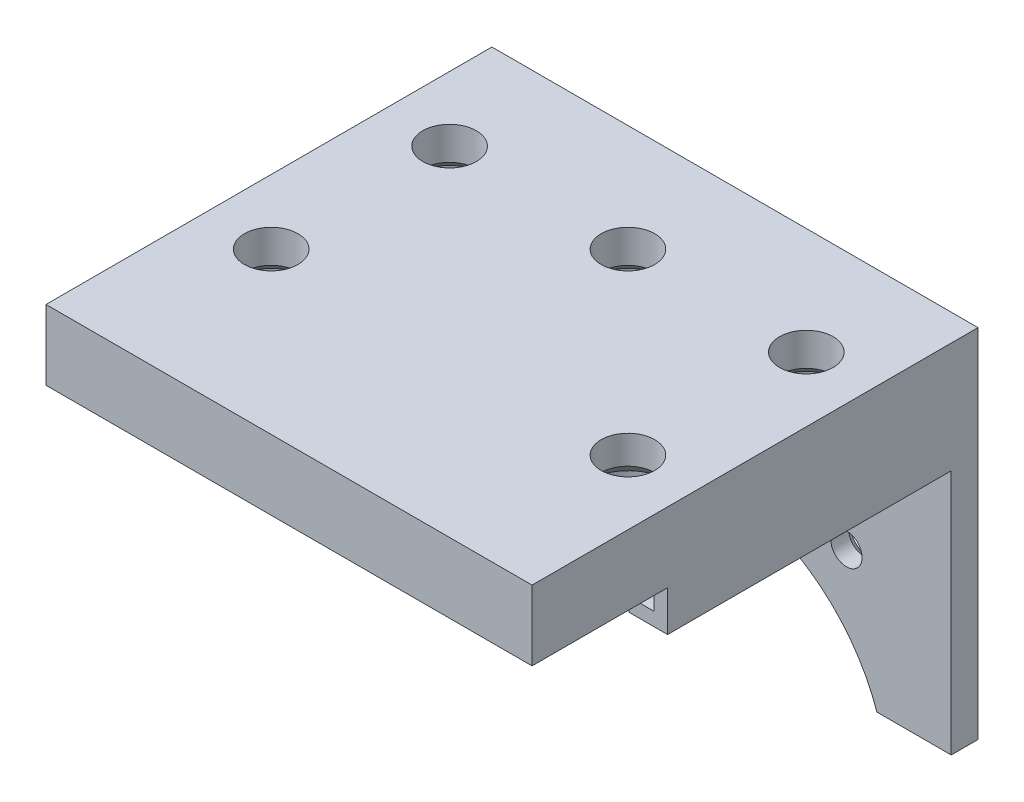
ISO-10303-21;
HEADER;
FILE_DESCRIPTION(('STEP AP214'),'2;1');
FILE_NAME('part.step','',(''),(''),'','','');
FILE_SCHEMA(('AUTOMOTIVE_DESIGN { 1 0 10303 214 1 1 1 1 }'));
ENDSEC;
DATA;
#1=APPLICATION_CONTEXT('core data for automotive mechanical design processes');
#2=APPLICATION_PROTOCOL_DEFINITION('international standard','automotive_design',2000,#1);
#3=PRODUCT_CONTEXT('',#1,'mechanical');
#4=PRODUCT('Part','Part','',(#3));
#5=PRODUCT_RELATED_PRODUCT_CATEGORY('part','',(#4));
#6=PRODUCT_DEFINITION_FORMATION('','',#4);
#7=PRODUCT_DEFINITION_CONTEXT('part definition',#1,'design');
#8=PRODUCT_DEFINITION('design','',#6,#7);
#9=PRODUCT_DEFINITION_SHAPE('','',#8);
#10=(LENGTH_UNIT() NAMED_UNIT(*) SI_UNIT(.MILLI.,.METRE.));
#11=(NAMED_UNIT(*) PLANE_ANGLE_UNIT() SI_UNIT($,.RADIAN.));
#12=(NAMED_UNIT(*) SI_UNIT($,.STERADIAN.) SOLID_ANGLE_UNIT());
#13=UNCERTAINTY_MEASURE_WITH_UNIT(LENGTH_MEASURE(1.E-05),#10,'distance_accuracy_value','');
#14=(GEOMETRIC_REPRESENTATION_CONTEXT(3) GLOBAL_UNCERTAINTY_ASSIGNED_CONTEXT((#13)) GLOBAL_UNIT_ASSIGNED_CONTEXT((#10,
#11,#12)) REPRESENTATION_CONTEXT('',''));
#15=CARTESIAN_POINT('',(0.,0.,0.));
#16=DIRECTION('',(0.,0.,1.));
#17=DIRECTION('',(1.,0.,0.));
#18=AXIS2_PLACEMENT_3D('',#15,#16,#17);
#19=CARTESIAN_POINT('',(48.65,-1.5,-9.5));
#20=DIRECTION('',(1.,0.,0.));
#21=DIRECTION('',(0.,0.,-1.));
#22=AXIS2_PLACEMENT_3D('',#19,#20,#21);
#23=PLANE('',#22);
#24=DIRECTION('',(0.,1.,0.));
#25=VECTOR('',#24,1.);
#26=CARTESIAN_POINT('',(48.65,-1.5,-6.5));
#27=LINE('',#26,#25);
#28=CARTESIAN_POINT('',(48.65,0.,-6.5));
#29=VERTEX_POINT('',#28);
#30=CARTESIAN_POINT('',(48.65,3.05,-6.5));
#31=VERTEX_POINT('',#30);
#32=EDGE_CURVE('E225',#29,#31,#27,.T.);
#33=ORIENTED_EDGE('',*,*,#32,.F.);
#34=DIRECTION('',(0.,0.,-1.));
#35=VECTOR('',#34,1.);
#36=CARTESIAN_POINT('',(48.65,0.,-9.5));
#37=LINE('',#36,#35);
#38=CARTESIAN_POINT('',(48.65,0.,25.309371378812));
#39=VERTEX_POINT('',#38);
#40=EDGE_CURVE('E285',#39,#29,#37,.T.);
#41=ORIENTED_EDGE('',*,*,#40,.F.);
#42=DIRECTION('',(0.,1.,0.));
#43=VECTOR('',#42,1.);
#44=CARTESIAN_POINT('',(48.65,-1.5,25.309371378812));
#45=LINE('',#44,#43);
#46=CARTESIAN_POINT('',(48.65,3.05,25.309371378812));
#47=VERTEX_POINT('',#46);
#48=EDGE_CURVE('E304',#39,#47,#45,.T.);
#49=ORIENTED_EDGE('',*,*,#48,.T.);
#50=DIRECTION('',(0.,0.,-1.));
#51=VECTOR('',#50,1.);
#52=CARTESIAN_POINT('',(48.65,3.05,-9.5));
#53=LINE('',#52,#51);
#54=EDGE_CURVE('E298',#47,#31,#53,.T.);
#55=ORIENTED_EDGE('',*,*,#54,.T.);
#56=EDGE_LOOP('',(#33,#41,#49,#55));
#57=FACE_BOUND('',#56,.T.);
#58=ADVANCED_FACE('F43',(#57),#23,.F.);
#59=CARTESIAN_POINT('',(0.,3.05,0.));
#60=DIRECTION('',(0.,-1.,0.));
#61=DIRECTION('',(0.,0.,-1.));
#62=AXIS2_PLACEMENT_3D('',#59,#60,#61);
#63=PLANE('',#62);
#64=CARTESIAN_POINT('',(42.9,3.05,22.5));
#65=DIRECTION('',(0.,-1.,0.));
#66=DIRECTION('',(0.,0.,-1.));
#67=AXIS2_PLACEMENT_3D('',#64,#65,#66);
#68=CIRCLE('',#67,4.5);
#69=CARTESIAN_POINT('',(42.9,3.05,18.));
#70=VERTEX_POINT('',#69);
#71=EDGE_CURVE('E237',#70,#70,#68,.T.);
#72=ORIENTED_EDGE('',*,*,#71,.F.);
#73=EDGE_LOOP('',(#72));
#74=FACE_BOUND('',#73,.T.);
#75=CARTESIAN_POINT('',(2.90000000000001,3.05,2.5));
#76=DIRECTION('',(0.,-1.,0.));
#77=DIRECTION('',(0.,0.,-1.));
#78=AXIS2_PLACEMENT_3D('',#75,#76,#77);
#79=CIRCLE('',#78,4.50000000000001);
#80=CARTESIAN_POINT('',(2.90000000000001,3.05,-2.00000000000001));
#81=VERTEX_POINT('',#80);
#82=EDGE_CURVE('E249',#81,#81,#79,.T.);
#83=ORIENTED_EDGE('',*,*,#82,.F.);
#84=EDGE_LOOP('',(#83));
#85=FACE_BOUND('',#84,.T.);
#86=CARTESIAN_POINT('',(42.9,3.05,2.5));
#87=DIRECTION('',(0.,-1.,0.));
#88=DIRECTION('',(0.,0.,-1.));
#89=AXIS2_PLACEMENT_3D('',#86,#87,#88);
#90=CIRCLE('',#89,4.50000000000001);
#91=CARTESIAN_POINT('',(42.9,3.05,-2.00000000000001));
#92=VERTEX_POINT('',#91);
#93=EDGE_CURVE('E258',#92,#92,#90,.T.);
#94=ORIENTED_EDGE('',*,*,#93,.F.);
#95=EDGE_LOOP('',(#94));
#96=FACE_BOUND('',#95,.T.);
#97=CARTESIAN_POINT('',(22.9,3.05,2.5));
#98=DIRECTION('',(0.,-1.,0.));
#99=DIRECTION('',(0.,0.,-1.));
#100=AXIS2_PLACEMENT_3D('',#97,#98,#99);
#101=CIRCLE('',#100,4.50000000000001);
#102=CARTESIAN_POINT('',(22.9,3.05,-2.00000000000001));
#103=VERTEX_POINT('',#102);
#104=EDGE_CURVE('E267',#103,#103,#101,.T.);
#105=ORIENTED_EDGE('',*,*,#104,.F.);
#106=EDGE_LOOP('',(#105));
#107=FACE_BOUND('',#106,.T.);
#108=CARTESIAN_POINT('',(2.9,3.05,22.5));
#109=DIRECTION('',(0.,-1.,0.));
#110=DIRECTION('',(0.,0.,-1.));
#111=AXIS2_PLACEMENT_3D('',#108,#109,#110);
#112=CIRCLE('',#111,4.50000000000001);
#113=CARTESIAN_POINT('',(2.9,3.05,18.));
#114=VERTEX_POINT('',#113);
#115=EDGE_CURVE('E276',#114,#114,#112,.T.);
#116=ORIENTED_EDGE('',*,*,#115,.F.);
#117=EDGE_LOOP('',(#116));
#118=FACE_BOUND('',#117,.T.);
#119=DIRECTION('',(0.,0.,1.));
#120=VECTOR('',#119,1.);
#121=CARTESIAN_POINT('',(-2.85,3.05,-15.7948391560071));
#122=LINE('',#121,#120);
#123=CARTESIAN_POINT('',(-2.85,3.05,-6.5));
#124=VERTEX_POINT('',#123);
#125=CARTESIAN_POINT('',(-2.85,3.05,25.5));
#126=VERTEX_POINT('',#125);
#127=EDGE_CURVE('E339',#124,#126,#122,.T.);
#128=ORIENTED_EDGE('',*,*,#127,.F.);
#129=DIRECTION('',(1.,0.,0.));
#130=VECTOR('',#129,1.);
#131=CARTESIAN_POINT('',(0.,3.05,-6.5));
#132=LINE('',#131,#130);
#133=EDGE_CURVE('E58',#124,#31,#132,.T.);
#134=ORIENTED_EDGE('',*,*,#133,.T.);
#135=ORIENTED_EDGE('',*,*,#54,.F.);
#136=DIRECTION('',(-1.,0.,0.));
#137=VECTOR('',#136,1.);
#138=CARTESIAN_POINT('',(48.65,3.05,25.309371378812));
#139=LINE('',#138,#137);
#140=CARTESIAN_POINT('',(50.15,3.05,25.309371378812));
#141=VERTEX_POINT('',#140);
#142=EDGE_CURVE('E301',#141,#47,#139,.T.);
#143=ORIENTED_EDGE('',*,*,#142,.F.);
#144=DIRECTION('',(0.,0.,1.));
#145=VECTOR('',#144,1.);
#146=CARTESIAN_POINT('',(50.15,3.05,-9.5));
#147=LINE('',#146,#145);
#148=CARTESIAN_POINT('',(50.15,3.05,40.5));
#149=VERTEX_POINT('',#148);
#150=EDGE_CURVE('E341',#141,#149,#147,.T.);
#151=ORIENTED_EDGE('',*,*,#150,.T.);
#152=DIRECTION('',(1.,0.,0.));
#153=VECTOR('',#152,1.);
#154=CARTESIAN_POINT('',(50.15,3.05,40.5));
#155=LINE('',#154,#153);
#156=CARTESIAN_POINT('',(-4.35,3.05,40.5));
#157=VERTEX_POINT('',#156);
#158=EDGE_CURVE('E317',#157,#149,#155,.T.);
#159=ORIENTED_EDGE('',*,*,#158,.F.);
#160=DIRECTION('',(0.,0.,-1.));
#161=VECTOR('',#160,1.);
#162=CARTESIAN_POINT('',(-4.35,3.05,40.5));
#163=LINE('',#162,#161);
#164=CARTESIAN_POINT('',(-4.35,3.05,25.5));
#165=VERTEX_POINT('',#164);
#166=EDGE_CURVE('E323',#157,#165,#163,.T.);
#167=ORIENTED_EDGE('',*,*,#166,.T.);
#168=DIRECTION('',(1.,0.,0.));
#169=VECTOR('',#168,1.);
#170=CARTESIAN_POINT('',(50.15,3.05,25.5));
#171=LINE('',#170,#169);
#172=EDGE_CURVE('E311',#165,#126,#171,.T.);
#173=ORIENTED_EDGE('',*,*,#172,.T.);
#174=EDGE_LOOP('',(#128,#134,#135,#143,#151,#159,#167,#173));
#175=FACE_BOUND('',#174,.T.);
#176=ADVANCED_FACE('F426',(#74,#85,#96,#107,#118,#175),#63,.T.);
#177=CARTESIAN_POINT('',(-4.35,-1.5,-15.7948391560071));
#178=DIRECTION('',(0.,-1.,0.));
#179=DIRECTION('',(1.,0.,0.));
#180=AXIS2_PLACEMENT_3D('',#177,#178,#179);
#181=PLANE('',#180);
#182=DIRECTION('',(0.,0.,1.));
#183=VECTOR('',#182,1.);
#184=CARTESIAN_POINT('',(-4.35,-1.5,-15.7948391560071));
#185=LINE('',#184,#183);
#186=CARTESIAN_POINT('',(-4.35,-1.5,-6.5));
#187=VERTEX_POINT('',#186);
#188=CARTESIAN_POINT('',(-4.35,-1.5,25.5));
#189=VERTEX_POINT('',#188);
#190=EDGE_CURVE('E66',#187,#189,#185,.T.);
#191=ORIENTED_EDGE('',*,*,#190,.F.);
#192=DIRECTION('',(1.,0.,0.));
#193=VECTOR('',#192,1.);
#194=CARTESIAN_POINT('',(-4.35,-1.5,-6.5));
#195=LINE('',#194,#193);
#196=CARTESIAN_POINT('',(0.,-1.5,-6.5));
#197=VERTEX_POINT('',#196);
#198=EDGE_CURVE('E235',#187,#197,#195,.T.);
#199=ORIENTED_EDGE('',*,*,#198,.T.);
#200=DIRECTION('',(0.,0.,1.));
#201=VECTOR('',#200,1.);
#202=CARTESIAN_POINT('',(0.,-1.5,-15.7948391560071));
#203=LINE('',#202,#201);
#204=CARTESIAN_POINT('',(0.,-1.5,25.5));
#205=VERTEX_POINT('',#204);
#206=EDGE_CURVE('E346',#197,#205,#203,.T.);
#207=ORIENTED_EDGE('',*,*,#206,.T.);
#208=DIRECTION('',(1.,0.,0.));
#209=VECTOR('',#208,1.);
#210=CARTESIAN_POINT('',(-4.35,-1.5,25.5));
#211=LINE('',#210,#209);
#212=EDGE_CURVE('E327',#189,#205,#211,.T.);
#213=ORIENTED_EDGE('',*,*,#212,.F.);
#214=EDGE_LOOP('',(#191,#199,#207,#213));
#215=FACE_BOUND('',#214,.T.);
#216=ADVANCED_FACE('F433',(#215),#181,.T.);
#217=CARTESIAN_POINT('',(0.,-1.5,-15.7948391560071));
#218=DIRECTION('',(1.,0.,0.));
#219=DIRECTION('',(0.,1.,0.));
#220=AXIS2_PLACEMENT_3D('',#217,#218,#219);
#221=PLANE('',#220);
#222=ORIENTED_EDGE('',*,*,#206,.F.);
#223=DIRECTION('',(0.,1.,0.));
#224=VECTOR('',#223,1.);
#225=CARTESIAN_POINT('',(0.,-1.5,-6.5));
#226=LINE('',#225,#224);
#227=CARTESIAN_POINT('',(0.,0.,-6.5));
#228=VERTEX_POINT('',#227);
#229=EDGE_CURVE('E233',#197,#228,#226,.T.);
#230=ORIENTED_EDGE('',*,*,#229,.T.);
#231=DIRECTION('',(0.,0.,1.));
#232=VECTOR('',#231,1.);
#233=CARTESIAN_POINT('',(0.,0.,-15.7948391560071));
#234=LINE('',#233,#232);
#235=CARTESIAN_POINT('',(0.,0.,25.5));
#236=VERTEX_POINT('',#235);
#237=EDGE_CURVE('E344',#228,#236,#234,.T.);
#238=ORIENTED_EDGE('',*,*,#237,.T.);
#239=DIRECTION('',(0.,1.,0.));
#240=VECTOR('',#239,1.);
#241=CARTESIAN_POINT('',(0.,-1.5,25.5));
#242=LINE('',#241,#240);
#243=EDGE_CURVE('E334',#205,#236,#242,.T.);
#244=ORIENTED_EDGE('',*,*,#243,.F.);
#245=EDGE_LOOP('',(#222,#230,#238,#244));
#246=FACE_BOUND('',#245,.T.);
#247=ADVANCED_FACE('F453',(#246),#221,.T.);
#248=CARTESIAN_POINT('',(0.,0.,-15.7948391560071));
#249=DIRECTION('',(0.,1.,0.));
#250=DIRECTION('',(-1.,0.,0.));
#251=AXIS2_PLACEMENT_3D('',#248,#249,#250);
#252=PLANE('',#251);
#253=ORIENTED_EDGE('',*,*,#237,.F.);
#254=DIRECTION('',(-1.,0.,0.));
#255=VECTOR('',#254,1.);
#256=CARTESIAN_POINT('',(0.,0.,-6.5));
#257=LINE('',#256,#255);
#258=CARTESIAN_POINT('',(-2.85,0.,-6.5));
#259=VERTEX_POINT('',#258);
#260=EDGE_CURVE('E231',#228,#259,#257,.T.);
#261=ORIENTED_EDGE('',*,*,#260,.T.);
#262=DIRECTION('',(0.,0.,1.));
#263=VECTOR('',#262,1.);
#264=CARTESIAN_POINT('',(-2.85,0.,-15.7948391560071));
#265=LINE('',#264,#263);
#266=CARTESIAN_POINT('',(-2.85,0.,25.5));
#267=VERTEX_POINT('',#266);
#268=EDGE_CURVE('E342',#259,#267,#265,.T.);
#269=ORIENTED_EDGE('',*,*,#268,.T.);
#270=DIRECTION('',(-1.,0.,0.));
#271=VECTOR('',#270,1.);
#272=CARTESIAN_POINT('',(0.,0.,25.5));
#273=LINE('',#272,#271);
#274=EDGE_CURVE('E331',#236,#267,#273,.T.);
#275=ORIENTED_EDGE('',*,*,#274,.F.);
#276=EDGE_LOOP('',(#253,#261,#269,#275));
#277=FACE_BOUND('',#276,.T.);
#278=ADVANCED_FACE('F449',(#277),#252,.T.);
#279=CARTESIAN_POINT('',(-2.85,0.,-15.7948391560071));
#280=DIRECTION('',(1.,0.,0.));
#281=DIRECTION('',(0.,0.,-1.));
#282=AXIS2_PLACEMENT_3D('',#279,#280,#281);
#283=PLANE('',#282);
#284=ORIENTED_EDGE('',*,*,#268,.F.);
#285=DIRECTION('',(0.,1.,0.));
#286=VECTOR('',#285,1.);
#287=CARTESIAN_POINT('',(-2.85,0.,-6.5));
#288=LINE('',#287,#286);
#289=EDGE_CURVE('E229',#259,#124,#288,.T.);
#290=ORIENTED_EDGE('',*,*,#289,.T.);
#291=ORIENTED_EDGE('',*,*,#127,.T.);
#292=DIRECTION('',(0.,1.,0.));
#293=VECTOR('',#292,1.);
#294=CARTESIAN_POINT('',(-2.85,0.,25.5));
#295=LINE('',#294,#293);
#296=EDGE_CURVE('E328',#267,#126,#295,.T.);
#297=ORIENTED_EDGE('',*,*,#296,.F.);
#298=EDGE_LOOP('',(#284,#290,#291,#297));
#299=FACE_BOUND('',#298,.T.);
#300=ADVANCED_FACE('F445',(#299),#283,.T.);
#301=CARTESIAN_POINT('',(0.,-1.5,0.));
#302=DIRECTION('',(0.,1.,0.));
#303=DIRECTION('',(0.,0.,1.));
#304=AXIS2_PLACEMENT_3D('',#301,#302,#303);
#305=PLANE('',#304);
#306=DIRECTION('',(-1.,0.,0.));
#307=VECTOR('',#306,1.);
#308=CARTESIAN_POINT('',(0.,-1.5,-6.5));
#309=LINE('',#308,#307);
#310=CARTESIAN_POINT('',(50.15,-1.5,-6.5));
#311=VERTEX_POINT('',#310);
#312=CARTESIAN_POINT('',(45.8,-1.5,-6.5));
#313=VERTEX_POINT('',#312);
#314=EDGE_CURVE('E223',#311,#313,#309,.T.);
#315=ORIENTED_EDGE('',*,*,#314,.F.);
#316=DIRECTION('',(0.,0.,1.));
#317=VECTOR('',#316,1.);
#318=CARTESIAN_POINT('',(50.15,-1.5,25.309371378812));
#319=LINE('',#318,#317);
#320=CARTESIAN_POINT('',(50.15,-1.5,25.309371378812));
#321=VERTEX_POINT('',#320);
#322=EDGE_CURVE('E177',#311,#321,#319,.T.);
#323=ORIENTED_EDGE('',*,*,#322,.T.);
#324=DIRECTION('',(-1.,0.,0.));
#325=VECTOR('',#324,1.);
#326=CARTESIAN_POINT('',(48.65,-1.5,25.309371378812));
#327=LINE('',#326,#325);
#328=CARTESIAN_POINT('',(45.8,-1.5,25.309371378812));
#329=VERTEX_POINT('',#328);
#330=EDGE_CURVE('E300',#321,#329,#327,.T.);
#331=ORIENTED_EDGE('',*,*,#330,.T.);
#332=DIRECTION('',(0.,0.,1.));
#333=VECTOR('',#332,1.);
#334=CARTESIAN_POINT('',(45.8,-1.5,25.309371378812));
#335=LINE('',#334,#333);
#336=EDGE_CURVE('E292',#313,#329,#335,.T.);
#337=ORIENTED_EDGE('',*,*,#336,.F.);
#338=EDGE_LOOP('',(#315,#323,#331,#337));
#339=FACE_BOUND('',#338,.T.);
#340=ADVANCED_FACE('F448',(#339),#305,.F.);
#341=CARTESIAN_POINT('',(45.8,0.,-9.5));
#342=DIRECTION('',(0.,-1.,0.));
#343=DIRECTION('',(0.,0.,-1.));
#344=AXIS2_PLACEMENT_3D('',#341,#342,#343);
#345=PLANE('',#344);
#346=DIRECTION('',(1.,0.,0.));
#347=VECTOR('',#346,1.);
#348=CARTESIAN_POINT('',(45.8,0.,-6.5));
#349=LINE('',#348,#347);
#350=CARTESIAN_POINT('',(45.8,0.,-6.5));
#351=VERTEX_POINT('',#350);
#352=EDGE_CURVE('E217',#351,#29,#349,.T.);
#353=ORIENTED_EDGE('',*,*,#352,.F.);
#354=DIRECTION('',(0.,0.,-1.));
#355=VECTOR('',#354,1.);
#356=CARTESIAN_POINT('',(45.8,0.,-9.5));
#357=LINE('',#356,#355);
#358=CARTESIAN_POINT('',(45.8,0.,25.309371378812));
#359=VERTEX_POINT('',#358);
#360=EDGE_CURVE('E289',#359,#351,#357,.T.);
#361=ORIENTED_EDGE('',*,*,#360,.F.);
#362=DIRECTION('',(1.,0.,0.));
#363=VECTOR('',#362,1.);
#364=CARTESIAN_POINT('',(45.8,0.,25.309371378812));
#365=LINE('',#364,#363);
#366=EDGE_CURVE('E294',#359,#39,#365,.T.);
#367=ORIENTED_EDGE('',*,*,#366,.T.);
#368=ORIENTED_EDGE('',*,*,#40,.T.);
#369=EDGE_LOOP('',(#353,#361,#367,#368));
#370=FACE_BOUND('',#369,.T.);
#371=ADVANCED_FACE('F549',(#370),#345,.F.);
#372=CARTESIAN_POINT('',(45.8,0.,0.));
#373=DIRECTION('',(1.,0.,0.));
#374=DIRECTION('',(0.,0.,-1.));
#375=AXIS2_PLACEMENT_3D('',#372,#373,#374);
#376=PLANE('',#375);
#377=DIRECTION('',(0.,1.,0.));
#378=VECTOR('',#377,1.);
#379=CARTESIAN_POINT('',(45.8,0.,-6.5));
#380=LINE('',#379,#378);
#381=EDGE_CURVE('E388',#313,#351,#380,.T.);
#382=ORIENTED_EDGE('',*,*,#381,.F.);
#383=ORIENTED_EDGE('',*,*,#336,.T.);
#384=DIRECTION('',(0.,1.,0.));
#385=VECTOR('',#384,1.);
#386=CARTESIAN_POINT('',(45.8,0.,25.309371378812));
#387=LINE('',#386,#385);
#388=EDGE_CURVE('E286',#329,#359,#387,.T.);
#389=ORIENTED_EDGE('',*,*,#388,.T.);
#390=ORIENTED_EDGE('',*,*,#360,.T.);
#391=EDGE_LOOP('',(#382,#383,#389,#390));
#392=FACE_BOUND('',#391,.T.);
#393=ADVANCED_FACE('F475',(#392),#376,.F.);
#394=CARTESIAN_POINT('',(50.15,10.9,-9.5));
#395=DIRECTION('',(1.,0.,0.));
#396=DIRECTION('',(0.,0.,-1.));
#397=AXIS2_PLACEMENT_3D('',#394,#395,#396);
#398=PLANE('',#397);
#399=DIRECTION('',(0.,0.,1.));
#400=VECTOR('',#399,1.);
#401=CARTESIAN_POINT('',(50.15,10.9,-9.5));
#402=LINE('',#401,#400);
#403=CARTESIAN_POINT('',(50.15,10.9,-9.5));
#404=VERTEX_POINT('',#403);
#405=CARTESIAN_POINT('',(50.15,10.9,40.5));
#406=VERTEX_POINT('',#405);
#407=EDGE_CURVE('E349',#404,#406,#402,.T.);
#408=ORIENTED_EDGE('',*,*,#407,.T.);
#409=DIRECTION('',(0.,1.,0.));
#410=VECTOR('',#409,1.);
#411=CARTESIAN_POINT('',(50.15,10.9,40.5));
#412=LINE('',#411,#410);
#413=EDGE_CURVE('E320',#149,#406,#412,.T.);
#414=ORIENTED_EDGE('',*,*,#413,.F.);
#415=ORIENTED_EDGE('',*,*,#150,.F.);
#416=DIRECTION('',(0.,1.,0.));
#417=VECTOR('',#416,1.);
#418=CARTESIAN_POINT('',(50.15,-1.5,25.309371378812));
#419=LINE('',#418,#417);
#420=EDGE_CURVE('E309',#321,#141,#419,.T.);
#421=ORIENTED_EDGE('',*,*,#420,.F.);
#422=ORIENTED_EDGE('',*,*,#322,.F.);
#423=DIRECTION('',(0.,-1.,0.));
#424=VECTOR('',#423,1.);
#425=CARTESIAN_POINT('',(50.15,10.9,-6.5));
#426=LINE('',#425,#424);
#427=CARTESIAN_POINT('',(50.15,-29.1,-6.5));
#428=VERTEX_POINT('',#427);
#429=EDGE_CURVE('E171',#311,#428,#426,.T.);
#430=ORIENTED_EDGE('',*,*,#429,.T.);
#431=DIRECTION('',(0.,0.,-1.));
#432=VECTOR('',#431,1.);
#433=CARTESIAN_POINT('',(50.15,-29.1,-6.5));
#434=LINE('',#433,#432);
#435=CARTESIAN_POINT('',(50.15,-29.1,-9.5));
#436=VERTEX_POINT('',#435);
#437=EDGE_CURVE('E174',#428,#436,#434,.T.);
#438=ORIENTED_EDGE('',*,*,#437,.T.);
#439=DIRECTION('',(0.,-1.,0.));
#440=VECTOR('',#439,1.);
#441=CARTESIAN_POINT('',(50.15,10.9,-9.5));
#442=LINE('',#441,#440);
#443=EDGE_CURVE('E358',#404,#436,#442,.T.);
#444=ORIENTED_EDGE('',*,*,#443,.F.);
#445=EDGE_LOOP('',(#408,#414,#415,#421,#422,#430,#438,#444));
#446=FACE_BOUND('',#445,.T.);
#447=ADVANCED_FACE('F173',(#446),#398,.T.);
#448=CARTESIAN_POINT('',(-4.35,10.9,-9.5));
#449=DIRECTION('',(0.,0.,-1.));
#450=DIRECTION('',(-1.,0.,0.));
#451=AXIS2_PLACEMENT_3D('',#448,#449,#450);
#452=PLANE('',#451);
#453=CARTESIAN_POINT('',(38.4,-14.95,-9.5));
#454=DIRECTION('',(0.,0.,-1.));
#455=DIRECTION('',(-1.,0.,0.));
#456=AXIS2_PLACEMENT_3D('',#453,#454,#455);
#457=CIRCLE('',#456,2.75000000000001);
#458=CARTESIAN_POINT('',(35.65,-14.95,-9.5));
#459=VERTEX_POINT('',#458);
#460=EDGE_CURVE('E51',#459,#459,#457,.F.);
#461=ORIENTED_EDGE('',*,*,#460,.T.);
#462=EDGE_LOOP('',(#461));
#463=FACE_BOUND('',#462,.T.);
#464=CARTESIAN_POINT('',(7.4,-14.95,-9.5));
#465=DIRECTION('',(0.,0.,-1.));
#466=DIRECTION('',(-1.,0.,0.));
#467=AXIS2_PLACEMENT_3D('',#464,#465,#466);
#468=CIRCLE('',#467,2.75000000000001);
#469=CARTESIAN_POINT('',(4.64999999999999,-14.95,-9.5));
#470=VERTEX_POINT('',#469);
#471=EDGE_CURVE('E394',#470,#470,#468,.F.);
#472=ORIENTED_EDGE('',*,*,#471,.T.);
#473=EDGE_LOOP('',(#472));
#474=FACE_BOUND('',#473,.T.);
#475=ORIENTED_EDGE('',*,*,#443,.T.);
#476=DIRECTION('',(-1.,0.,0.));
#477=VECTOR('',#476,1.);
#478=CARTESIAN_POINT('',(50.15,-29.1,-9.5));
#479=LINE('',#478,#477);
#480=CARTESIAN_POINT('',(41.8142803193777,-29.1,-9.5));
#481=VERTEX_POINT('',#480);
#482=EDGE_CURVE('E188',#436,#481,#479,.T.);
#483=ORIENTED_EDGE('',*,*,#482,.T.);
#484=CARTESIAN_POINT('',(22.9,-35.6,-9.5));
#485=DIRECTION('',(0.,0.,1.));
#486=DIRECTION('',(-1.,0.,0.));
#487=AXIS2_PLACEMENT_3D('',#484,#485,#486);
#488=CIRCLE('',#487,20.);
#489=CARTESIAN_POINT('',(3.98571968062227,-29.1,-9.5));
#490=VERTEX_POINT('',#489);
#491=EDGE_CURVE('E208',#481,#490,#488,.T.);
#492=ORIENTED_EDGE('',*,*,#491,.T.);
#493=DIRECTION('',(-1.,0.,0.));
#494=VECTOR('',#493,1.);
#495=CARTESIAN_POINT('',(3.98571968062227,-29.1,-9.5));
#496=LINE('',#495,#494);
#497=CARTESIAN_POINT('',(-4.35,-29.1,-9.5));
#498=VERTEX_POINT('',#497);
#499=EDGE_CURVE('E182',#490,#498,#496,.T.);
#500=ORIENTED_EDGE('',*,*,#499,.T.);
#501=DIRECTION('',(0.,-1.,0.));
#502=VECTOR('',#501,1.);
#503=CARTESIAN_POINT('',(-4.35,10.9,-9.5));
#504=LINE('',#503,#502);
#505=CARTESIAN_POINT('',(-4.35,10.9,-9.5));
#506=VERTEX_POINT('',#505);
#507=EDGE_CURVE('E361',#506,#498,#504,.T.);
#508=ORIENTED_EDGE('',*,*,#507,.F.);
#509=DIRECTION('',(1.,0.,0.));
#510=VECTOR('',#509,1.);
#511=CARTESIAN_POINT('',(-4.35,10.9,-9.5));
#512=LINE('',#511,#510);
#513=EDGE_CURVE('E353',#506,#404,#512,.T.);
#514=ORIENTED_EDGE('',*,*,#513,.T.);
#515=EDGE_LOOP('',(#475,#483,#492,#500,#508,#514));
#516=FACE_BOUND('',#515,.T.);
#517=ADVANCED_FACE('F399',(#463,#474,#516),#452,.T.);
#518=CARTESIAN_POINT('',(-4.35,10.9,25.5));
#519=DIRECTION('',(-1.,0.,0.));
#520=DIRECTION('',(0.,0.,1.));
#521=AXIS2_PLACEMENT_3D('',#518,#519,#520);
#522=PLANE('',#521);
#523=DIRECTION('',(0.,1.,0.));
#524=VECTOR('',#523,1.);
#525=CARTESIAN_POINT('',(-4.35,10.9,-6.5));
#526=LINE('',#525,#524);
#527=CARTESIAN_POINT('',(-4.35,-29.1,-6.5));
#528=VERTEX_POINT('',#527);
#529=EDGE_CURVE('E190',#528,#187,#526,.T.);
#530=ORIENTED_EDGE('',*,*,#529,.T.);
#531=ORIENTED_EDGE('',*,*,#190,.T.);
#532=DIRECTION('',(0.,-1.,0.));
#533=VECTOR('',#532,1.);
#534=CARTESIAN_POINT('',(-4.35,10.9,25.5));
#535=LINE('',#534,#533);
#536=EDGE_CURVE('E356',#165,#189,#535,.T.);
#537=ORIENTED_EDGE('',*,*,#536,.F.);
#538=ORIENTED_EDGE('',*,*,#166,.F.);
#539=DIRECTION('',(0.,-1.,0.));
#540=VECTOR('',#539,1.);
#541=CARTESIAN_POINT('',(-4.35,3.05,40.5));
#542=LINE('',#541,#540);
#543=CARTESIAN_POINT('',(-4.35,10.9,40.5));
#544=VERTEX_POINT('',#543);
#545=EDGE_CURVE('E315',#544,#157,#542,.T.);
#546=ORIENTED_EDGE('',*,*,#545,.F.);
#547=DIRECTION('',(0.,0.,-1.));
#548=VECTOR('',#547,1.);
#549=CARTESIAN_POINT('',(-4.35,10.9,25.5));
#550=LINE('',#549,#548);
#551=EDGE_CURVE('E351',#544,#506,#550,.T.);
#552=ORIENTED_EDGE('',*,*,#551,.T.);
#553=ORIENTED_EDGE('',*,*,#507,.T.);
#554=DIRECTION('',(0.,0.,-1.));
#555=VECTOR('',#554,1.);
#556=CARTESIAN_POINT('',(-4.35,-29.1,-6.5));
#557=LINE('',#556,#555);
#558=EDGE_CURVE('E214',#528,#498,#557,.T.);
#559=ORIENTED_EDGE('',*,*,#558,.F.);
#560=EDGE_LOOP('',(#530,#531,#537,#538,#546,#552,#553,#559));
#561=FACE_BOUND('',#560,.T.);
#562=ADVANCED_FACE('F466',(#561),#522,.T.);
#563=CARTESIAN_POINT('',(50.15,10.9,25.5));
#564=DIRECTION('',(0.,0.,1.));
#565=DIRECTION('',(1.,0.,0.));
#566=AXIS2_PLACEMENT_3D('',#563,#564,#565);
#567=PLANE('',#566);
#568=ORIENTED_EDGE('',*,*,#172,.F.);
#569=ORIENTED_EDGE('',*,*,#536,.T.);
#570=ORIENTED_EDGE('',*,*,#212,.T.);
#571=ORIENTED_EDGE('',*,*,#243,.T.);
#572=ORIENTED_EDGE('',*,*,#274,.T.);
#573=ORIENTED_EDGE('',*,*,#296,.T.);
#574=EDGE_LOOP('',(#568,#569,#570,#571,#572,#573));
#575=FACE_BOUND('',#574,.T.);
#576=ADVANCED_FACE('F461',(#575),#567,.T.);
#577=CARTESIAN_POINT('',(0.,10.9,0.));
#578=DIRECTION('',(0.,-1.,0.));
#579=DIRECTION('',(0.,0.,-1.));
#580=AXIS2_PLACEMENT_3D('',#577,#578,#579);
#581=PLANE('',#580);
#582=ORIENTED_EDGE('',*,*,#513,.F.);
#583=ORIENTED_EDGE('',*,*,#551,.F.);
#584=DIRECTION('',(-1.,0.,0.));
#585=VECTOR('',#584,1.);
#586=CARTESIAN_POINT('',(-4.35,10.9,40.5));
#587=LINE('',#586,#585);
#588=EDGE_CURVE('E312',#406,#544,#587,.T.);
#589=ORIENTED_EDGE('',*,*,#588,.F.);
#590=ORIENTED_EDGE('',*,*,#407,.F.);
#591=EDGE_LOOP('',(#582,#583,#589,#590));
#592=FACE_BOUND('',#591,.T.);
#593=CARTESIAN_POINT('',(2.9,10.9,22.5));
#594=DIRECTION('',(0.,-1.,0.));
#595=DIRECTION('',(0.,0.,-1.));
#596=AXIS2_PLACEMENT_3D('',#593,#594,#595);
#597=CIRCLE('',#596,3.00000000000001);
#598=CARTESIAN_POINT('',(2.9,10.9,19.5));
#599=VERTEX_POINT('',#598);
#600=EDGE_CURVE('E282',#599,#599,#597,.T.);
#601=ORIENTED_EDGE('',*,*,#600,.T.);
#602=EDGE_LOOP('',(#601));
#603=FACE_BOUND('',#602,.T.);
#604=CARTESIAN_POINT('',(22.9,10.9,2.5));
#605=DIRECTION('',(0.,-1.,0.));
#606=DIRECTION('',(0.,0.,-1.));
#607=AXIS2_PLACEMENT_3D('',#604,#605,#606);
#608=CIRCLE('',#607,3.00000000000001);
#609=CARTESIAN_POINT('',(22.9,10.9,-0.500000000000014));
#610=VERTEX_POINT('',#609);
#611=EDGE_CURVE('E273',#610,#610,#608,.T.);
#612=ORIENTED_EDGE('',*,*,#611,.T.);
#613=EDGE_LOOP('',(#612));
#614=FACE_BOUND('',#613,.T.);
#615=CARTESIAN_POINT('',(42.9,10.9,2.5));
#616=DIRECTION('',(0.,-1.,0.));
#617=DIRECTION('',(0.,0.,-1.));
#618=AXIS2_PLACEMENT_3D('',#615,#616,#617);
#619=CIRCLE('',#618,3.00000000000001);
#620=CARTESIAN_POINT('',(42.9,10.9,-0.50000000000001));
#621=VERTEX_POINT('',#620);
#622=EDGE_CURVE('E264',#621,#621,#619,.T.);
#623=ORIENTED_EDGE('',*,*,#622,.T.);
#624=EDGE_LOOP('',(#623));
#625=FACE_BOUND('',#624,.T.);
#626=CARTESIAN_POINT('',(2.90000000000001,10.9,2.5));
#627=DIRECTION('',(0.,-1.,0.));
#628=DIRECTION('',(0.,0.,-1.));
#629=AXIS2_PLACEMENT_3D('',#626,#627,#628);
#630=CIRCLE('',#629,3.00000000000001);
#631=CARTESIAN_POINT('',(2.90000000000001,10.9,-0.500000000000013));
#632=VERTEX_POINT('',#631);
#633=EDGE_CURVE('E255',#632,#632,#630,.T.);
#634=ORIENTED_EDGE('',*,*,#633,.T.);
#635=EDGE_LOOP('',(#634));
#636=FACE_BOUND('',#635,.T.);
#637=CARTESIAN_POINT('',(42.9,10.9,22.5));
#638=DIRECTION('',(0.,-1.,0.));
#639=DIRECTION('',(0.,0.,-1.));
#640=AXIS2_PLACEMENT_3D('',#637,#638,#639);
#641=CIRCLE('',#640,3.);
#642=CARTESIAN_POINT('',(42.9,10.9,19.5));
#643=VERTEX_POINT('',#642);
#644=EDGE_CURVE('E246',#643,#643,#641,.T.);
#645=ORIENTED_EDGE('',*,*,#644,.T.);
#646=EDGE_LOOP('',(#645));
#647=FACE_BOUND('',#646,.T.);
#648=ADVANCED_FACE('F443',(#592,#603,#614,#625,#636,#647),#581,.F.);
#649=CARTESIAN_POINT('',(0.,0.,40.5));
#650=DIRECTION('',(0.,0.,-1.));
#651=DIRECTION('',(-1.,0.,0.));
#652=AXIS2_PLACEMENT_3D('',#649,#650,#651);
#653=PLANE('',#652);
#654=ORIENTED_EDGE('',*,*,#588,.T.);
#655=ORIENTED_EDGE('',*,*,#545,.T.);
#656=ORIENTED_EDGE('',*,*,#158,.T.);
#657=ORIENTED_EDGE('',*,*,#413,.T.);
#658=EDGE_LOOP('',(#654,#655,#656,#657));
#659=FACE_BOUND('',#658,.T.);
#660=ADVANCED_FACE('F440',(#659),#653,.F.);
#661=CARTESIAN_POINT('',(48.65,-1.5,25.309371378812));
#662=DIRECTION('',(0.,0.,-1.));
#663=DIRECTION('',(-1.,0.,0.));
#664=AXIS2_PLACEMENT_3D('',#661,#662,#663);
#665=PLANE('',#664);
#666=ORIENTED_EDGE('',*,*,#142,.T.);
#667=ORIENTED_EDGE('',*,*,#48,.F.);
#668=ORIENTED_EDGE('',*,*,#366,.F.);
#669=ORIENTED_EDGE('',*,*,#388,.F.);
#670=ORIENTED_EDGE('',*,*,#330,.F.);
#671=ORIENTED_EDGE('',*,*,#420,.T.);
#672=EDGE_LOOP('',(#666,#667,#668,#669,#670,#671));
#673=FACE_BOUND('',#672,.T.);
#674=ADVANCED_FACE('F438',(#673),#665,.F.);
#675=CARTESIAN_POINT('',(2.9,3.05,22.5));
#676=DIRECTION('',(0.,-1.,0.));
#677=DIRECTION('',(0.,0.,-1.));
#678=AXIS2_PLACEMENT_3D('',#675,#676,#677);
#679=CYLINDRICAL_SURFACE('',#678,3.00000000000001);
#680=CARTESIAN_POINT('',(2.9,7.19999999999286,22.5));
#681=DIRECTION('',(0.,1.,0.));
#682=DIRECTION('',(0.,0.,1.));
#683=AXIS2_PLACEMENT_3D('',#680,#681,#682);
#684=CIRCLE('',#683,3.00000000000001);
#685=CARTESIAN_POINT('',(2.9,7.19999999999286,25.5));
#686=VERTEX_POINT('',#685);
#687=EDGE_CURVE('E360',#686,#686,#684,.F.);
#688=ORIENTED_EDGE('',*,*,#687,.T.);
#689=EDGE_LOOP('',(#688));
#690=FACE_BOUND('',#689,.T.);
#691=ORIENTED_EDGE('',*,*,#600,.F.);
#692=EDGE_LOOP('',(#691));
#693=FACE_BOUND('',#692,.T.);
#694=ADVANCED_FACE('F621',(#690,#693),#679,.F.);
#695=CARTESIAN_POINT('',(5.90000000000001,6.2,22.5));
#696=DIRECTION('',(0.,1.,0.));
#697=DIRECTION('',(0.,0.,1.));
#698=AXIS2_PLACEMENT_3D('',#695,#696,#697);
#699=PLANE('',#698);
#700=CARTESIAN_POINT('',(2.9,6.2,22.5));
#701=DIRECTION('',(0.,1.,0.));
#702=DIRECTION('',(0.,0.,1.));
#703=AXIS2_PLACEMENT_3D('',#700,#701,#702);
#704=CIRCLE('',#703,3.99999999999287);
#705=CARTESIAN_POINT('',(2.9,6.2,26.4999999999929));
#706=VERTEX_POINT('',#705);
#707=EDGE_CURVE('E367',#706,#706,#704,.T.);
#708=ORIENTED_EDGE('',*,*,#707,.T.);
#709=EDGE_LOOP('',(#708));
#710=FACE_BOUND('',#709,.T.);
#711=CARTESIAN_POINT('',(2.9,6.2,22.5));
#712=DIRECTION('',(0.,-1.,0.));
#713=DIRECTION('',(0.,0.,-1.));
#714=AXIS2_PLACEMENT_3D('',#711,#712,#713);
#715=CIRCLE('',#714,4.50000000000001);
#716=CARTESIAN_POINT('',(2.9,6.2,18.));
#717=VERTEX_POINT('',#716);
#718=EDGE_CURVE('E279',#717,#717,#715,.T.);
#719=ORIENTED_EDGE('',*,*,#718,.T.);
#720=EDGE_LOOP('',(#719));
#721=FACE_BOUND('',#720,.T.);
#722=ADVANCED_FACE('F617',(#710,#721),#699,.F.);
#723=CARTESIAN_POINT('',(2.9,3.05,22.5));
#724=DIRECTION('',(0.,-1.,0.));
#725=DIRECTION('',(0.,0.,-1.));
#726=AXIS2_PLACEMENT_3D('',#723,#724,#725);
#727=CYLINDRICAL_SURFACE('',#726,4.50000000000001);
#728=ORIENTED_EDGE('',*,*,#718,.F.);
#729=EDGE_LOOP('',(#728));
#730=FACE_BOUND('',#729,.T.);
#731=ORIENTED_EDGE('',*,*,#115,.T.);
#732=EDGE_LOOP('',(#731));
#733=FACE_BOUND('',#732,.T.);
#734=ADVANCED_FACE('F506',(#730,#733),#727,.F.);
#735=CARTESIAN_POINT('',(22.9,3.05,2.5));
#736=DIRECTION('',(0.,-1.,0.));
#737=DIRECTION('',(0.,0.,-1.));
#738=AXIS2_PLACEMENT_3D('',#735,#736,#737);
#739=CYLINDRICAL_SURFACE('',#738,3.00000000000001);
#740=CARTESIAN_POINT('',(22.9,7.19999999999284,2.5));
#741=DIRECTION('',(0.,1.,0.));
#742=DIRECTION('',(0.,0.,1.));
#743=AXIS2_PLACEMENT_3D('',#740,#741,#742);
#744=CIRCLE('',#743,3.00000000000001);
#745=CARTESIAN_POINT('',(22.9,7.19999999999284,5.50000000000001));
#746=VERTEX_POINT('',#745);
#747=EDGE_CURVE('E382',#746,#746,#744,.F.);
#748=ORIENTED_EDGE('',*,*,#747,.T.);
#749=EDGE_LOOP('',(#748));
#750=FACE_BOUND('',#749,.T.);
#751=ORIENTED_EDGE('',*,*,#611,.F.);
#752=EDGE_LOOP('',(#751));
#753=FACE_BOUND('',#752,.T.);
#754=ADVANCED_FACE('F502',(#750,#753),#739,.F.);
#755=CARTESIAN_POINT('',(25.9,6.2,2.5));
#756=DIRECTION('',(0.,1.,0.));
#757=DIRECTION('',(0.,0.,1.));
#758=AXIS2_PLACEMENT_3D('',#755,#756,#757);
#759=PLANE('',#758);
#760=CARTESIAN_POINT('',(22.9,6.2,2.5));
#761=DIRECTION('',(0.,1.,0.));
#762=DIRECTION('',(0.,0.,1.));
#763=AXIS2_PLACEMENT_3D('',#760,#761,#762);
#764=CIRCLE('',#763,3.99999999999286);
#765=CARTESIAN_POINT('',(22.9,6.2,6.49999999999286));
#766=VERTEX_POINT('',#765);
#767=EDGE_CURVE('E385',#766,#766,#764,.T.);
#768=ORIENTED_EDGE('',*,*,#767,.T.);
#769=EDGE_LOOP('',(#768));
#770=FACE_BOUND('',#769,.T.);
#771=CARTESIAN_POINT('',(22.9,6.2,2.5));
#772=DIRECTION('',(0.,-1.,0.));
#773=DIRECTION('',(0.,0.,-1.));
#774=AXIS2_PLACEMENT_3D('',#771,#772,#773);
#775=CIRCLE('',#774,4.50000000000001);
#776=CARTESIAN_POINT('',(22.9,6.2,-2.00000000000001));
#777=VERTEX_POINT('',#776);
#778=EDGE_CURVE('E270',#777,#777,#775,.T.);
#779=ORIENTED_EDGE('',*,*,#778,.T.);
#780=EDGE_LOOP('',(#779));
#781=FACE_BOUND('',#780,.T.);
#782=ADVANCED_FACE('F505',(#770,#781),#759,.F.);
#783=CARTESIAN_POINT('',(22.9,3.05,2.5));
#784=DIRECTION('',(0.,-1.,0.));
#785=DIRECTION('',(0.,0.,-1.));
#786=AXIS2_PLACEMENT_3D('',#783,#784,#785);
#787=CYLINDRICAL_SURFACE('',#786,4.50000000000001);
#788=ORIENTED_EDGE('',*,*,#778,.F.);
#789=EDGE_LOOP('',(#788));
#790=FACE_BOUND('',#789,.T.);
#791=ORIENTED_EDGE('',*,*,#104,.T.);
#792=EDGE_LOOP('',(#791));
#793=FACE_BOUND('',#792,.T.);
#794=ADVANCED_FACE('F607',(#790,#793),#787,.F.);
#795=CARTESIAN_POINT('',(42.9,3.05,2.5));
#796=DIRECTION('',(0.,-1.,0.));
#797=DIRECTION('',(0.,0.,-1.));
#798=AXIS2_PLACEMENT_3D('',#795,#796,#797);
#799=CYLINDRICAL_SURFACE('',#798,3.00000000000001);
#800=CARTESIAN_POINT('',(42.9,7.19999999999284,2.5));
#801=DIRECTION('',(0.,1.,0.));
#802=DIRECTION('',(0.,0.,1.));
#803=AXIS2_PLACEMENT_3D('',#800,#801,#802);
#804=CIRCLE('',#803,3.00000000000001);
#805=CARTESIAN_POINT('',(42.9,7.19999999999284,5.50000000000001));
#806=VERTEX_POINT('',#805);
#807=EDGE_CURVE('E376',#806,#806,#804,.F.);
#808=ORIENTED_EDGE('',*,*,#807,.T.);
#809=EDGE_LOOP('',(#808));
#810=FACE_BOUND('',#809,.T.);
#811=ORIENTED_EDGE('',*,*,#622,.F.);
#812=EDGE_LOOP('',(#811));
#813=FACE_BOUND('',#812,.T.);
#814=ADVANCED_FACE('F603',(#810,#813),#799,.F.);
#815=CARTESIAN_POINT('',(45.9,6.2,2.5));
#816=DIRECTION('',(0.,1.,0.));
#817=DIRECTION('',(0.,0.,1.));
#818=AXIS2_PLACEMENT_3D('',#815,#816,#817);
#819=PLANE('',#818);
#820=CARTESIAN_POINT('',(42.9,6.2,2.5));
#821=DIRECTION('',(0.,1.,0.));
#822=DIRECTION('',(0.,0.,1.));
#823=AXIS2_PLACEMENT_3D('',#820,#821,#822);
#824=CIRCLE('',#823,3.99999999999286);
#825=CARTESIAN_POINT('',(42.9,6.2,6.49999999999286));
#826=VERTEX_POINT('',#825);
#827=EDGE_CURVE('E379',#826,#826,#824,.T.);
#828=ORIENTED_EDGE('',*,*,#827,.T.);
#829=EDGE_LOOP('',(#828));
#830=FACE_BOUND('',#829,.T.);
#831=CARTESIAN_POINT('',(42.9,6.2,2.5));
#832=DIRECTION('',(0.,-1.,0.));
#833=DIRECTION('',(0.,0.,-1.));
#834=AXIS2_PLACEMENT_3D('',#831,#832,#833);
#835=CIRCLE('',#834,4.50000000000001);
#836=CARTESIAN_POINT('',(42.9,6.2,-2.00000000000001));
#837=VERTEX_POINT('',#836);
#838=EDGE_CURVE('E261',#837,#837,#835,.T.);
#839=ORIENTED_EDGE('',*,*,#838,.T.);
#840=EDGE_LOOP('',(#839));
#841=FACE_BOUND('',#840,.T.);
#842=ADVANCED_FACE('F599',(#830,#841),#819,.F.);
#843=CARTESIAN_POINT('',(42.9,3.05,2.5));
#844=DIRECTION('',(0.,-1.,0.));
#845=DIRECTION('',(0.,0.,-1.));
#846=AXIS2_PLACEMENT_3D('',#843,#844,#845);
#847=CYLINDRICAL_SURFACE('',#846,4.50000000000001);
#848=ORIENTED_EDGE('',*,*,#838,.F.);
#849=EDGE_LOOP('',(#848));
#850=FACE_BOUND('',#849,.T.);
#851=ORIENTED_EDGE('',*,*,#93,.T.);
#852=EDGE_LOOP('',(#851));
#853=FACE_BOUND('',#852,.T.);
#854=ADVANCED_FACE('F595',(#850,#853),#847,.F.);
#855=CARTESIAN_POINT('',(2.90000000000001,3.05,2.5));
#856=DIRECTION('',(0.,-1.,0.));
#857=DIRECTION('',(0.,0.,-1.));
#858=AXIS2_PLACEMENT_3D('',#855,#856,#857);
#859=CYLINDRICAL_SURFACE('',#858,3.00000000000001);
#860=CARTESIAN_POINT('',(2.90000000000001,7.19999999999284,2.5));
#861=DIRECTION('',(0.,1.,0.));
#862=DIRECTION('',(0.,0.,1.));
#863=AXIS2_PLACEMENT_3D('',#860,#861,#862);
#864=CIRCLE('',#863,3.00000000000001);
#865=CARTESIAN_POINT('',(2.90000000000001,7.19999999999284,5.50000000000001));
#866=VERTEX_POINT('',#865);
#867=EDGE_CURVE('E370',#866,#866,#864,.F.);
#868=ORIENTED_EDGE('',*,*,#867,.T.);
#869=EDGE_LOOP('',(#868));
#870=FACE_BOUND('',#869,.T.);
#871=ORIENTED_EDGE('',*,*,#633,.F.);
#872=EDGE_LOOP('',(#871));
#873=FACE_BOUND('',#872,.T.);
#874=ADVANCED_FACE('F591',(#870,#873),#859,.F.);
#875=CARTESIAN_POINT('',(5.90000000000003,6.2,2.5));
#876=DIRECTION('',(0.,1.,0.));
#877=DIRECTION('',(0.,0.,1.));
#878=AXIS2_PLACEMENT_3D('',#875,#876,#877);
#879=PLANE('',#878);
#880=CARTESIAN_POINT('',(2.90000000000001,6.2,2.5));
#881=DIRECTION('',(0.,1.,0.));
#882=DIRECTION('',(0.,0.,1.));
#883=AXIS2_PLACEMENT_3D('',#880,#881,#882);
#884=CIRCLE('',#883,3.99999999999286);
#885=CARTESIAN_POINT('',(2.90000000000001,6.2,6.49999999999286));
#886=VERTEX_POINT('',#885);
#887=EDGE_CURVE('E373',#886,#886,#884,.T.);
#888=ORIENTED_EDGE('',*,*,#887,.T.);
#889=EDGE_LOOP('',(#888));
#890=FACE_BOUND('',#889,.T.);
#891=CARTESIAN_POINT('',(2.90000000000001,6.2,2.5));
#892=DIRECTION('',(0.,-1.,0.));
#893=DIRECTION('',(0.,0.,-1.));
#894=AXIS2_PLACEMENT_3D('',#891,#892,#893);
#895=CIRCLE('',#894,4.50000000000001);
#896=CARTESIAN_POINT('',(2.90000000000001,6.2,-2.00000000000001));
#897=VERTEX_POINT('',#896);
#898=EDGE_CURVE('E252',#897,#897,#895,.T.);
#899=ORIENTED_EDGE('',*,*,#898,.T.);
#900=EDGE_LOOP('',(#899));
#901=FACE_BOUND('',#900,.T.);
#902=ADVANCED_FACE('F587',(#890,#901),#879,.F.);
#903=CARTESIAN_POINT('',(2.90000000000001,3.05,2.5));
#904=DIRECTION('',(0.,-1.,0.));
#905=DIRECTION('',(0.,0.,-1.));
#906=AXIS2_PLACEMENT_3D('',#903,#904,#905);
#907=CYLINDRICAL_SURFACE('',#906,4.50000000000001);
#908=ORIENTED_EDGE('',*,*,#898,.F.);
#909=EDGE_LOOP('',(#908));
#910=FACE_BOUND('',#909,.T.);
#911=ORIENTED_EDGE('',*,*,#82,.T.);
#912=EDGE_LOOP('',(#911));
#913=FACE_BOUND('',#912,.T.);
#914=ADVANCED_FACE('F521',(#910,#913),#907,.F.);
#915=CARTESIAN_POINT('',(42.9,3.05,22.5));
#916=DIRECTION('',(0.,-1.,0.));
#917=DIRECTION('',(0.,0.,-1.));
#918=AXIS2_PLACEMENT_3D('',#915,#916,#917);
#919=CYLINDRICAL_SURFACE('',#918,3.00000000000001);
#920=ORIENTED_EDGE('',*,*,#644,.F.);
#921=EDGE_LOOP('',(#920));
#922=FACE_BOUND('',#921,.T.);
#923=CARTESIAN_POINT('',(42.9,7.69999999999997,22.5));
#924=DIRECTION('',(0.,-1.,0.));
#925=DIRECTION('',(0.,0.,-1.));
#926=AXIS2_PLACEMENT_3D('',#923,#924,#925);
#927=CIRCLE('',#926,3.00000000000002);
#928=CARTESIAN_POINT('',(42.9,7.69999999999997,19.5));
#929=VERTEX_POINT('',#928);
#930=EDGE_CURVE('E243',#929,#929,#927,.T.);
#931=ORIENTED_EDGE('',*,*,#930,.T.);
#932=EDGE_LOOP('',(#931));
#933=FACE_BOUND('',#932,.T.);
#934=ADVANCED_FACE('F517',(#922,#933),#919,.F.);
#935=CARTESIAN_POINT('',(42.9,6.2,22.5));
#936=DIRECTION('',(0.,-1.,0.));
#937=DIRECTION('',(0.,0.,-1.));
#938=AXIS2_PLACEMENT_3D('',#935,#936,#937);
#939=CONICAL_SURFACE('',#938,4.5,0.785398163397451);
#940=ORIENTED_EDGE('',*,*,#930,.F.);
#941=EDGE_LOOP('',(#940));
#942=FACE_BOUND('',#941,.T.);
#943=CARTESIAN_POINT('',(42.9,6.2,22.5));
#944=DIRECTION('',(0.,-1.,0.));
#945=DIRECTION('',(0.,0.,-1.));
#946=AXIS2_PLACEMENT_3D('',#943,#944,#945);
#947=CIRCLE('',#946,4.5);
#948=CARTESIAN_POINT('',(42.9,6.2,18.));
#949=VERTEX_POINT('',#948);
#950=EDGE_CURVE('E240',#949,#949,#947,.T.);
#951=ORIENTED_EDGE('',*,*,#950,.T.);
#952=EDGE_LOOP('',(#951));
#953=FACE_BOUND('',#952,.T.);
#954=ADVANCED_FACE('F520',(#942,#953),#939,.F.);
#955=CARTESIAN_POINT('',(42.9,3.05,22.5));
#956=DIRECTION('',(0.,-1.,0.));
#957=DIRECTION('',(0.,0.,-1.));
#958=AXIS2_PLACEMENT_3D('',#955,#956,#957);
#959=CYLINDRICAL_SURFACE('',#958,4.5);
#960=ORIENTED_EDGE('',*,*,#950,.F.);
#961=EDGE_LOOP('',(#960));
#962=FACE_BOUND('',#961,.T.);
#963=ORIENTED_EDGE('',*,*,#71,.T.);
#964=EDGE_LOOP('',(#963));
#965=FACE_BOUND('',#964,.T.);
#966=ADVANCED_FACE('F480',(#962,#965),#959,.F.);
#967=CARTESIAN_POINT('',(2.9,7.19999999999286,22.5));
#968=DIRECTION('',(0.,-1.,0.));
#969=DIRECTION('',(0.,0.,-1.));
#970=AXIS2_PLACEMENT_3D('',#967,#968,#969);
#971=CONICAL_SURFACE('',#970,3.00000000000001,0.785398163397448);
#972=ORIENTED_EDGE('',*,*,#707,.F.);
#973=EDGE_LOOP('',(#972));
#974=FACE_BOUND('',#973,.T.);
#975=ORIENTED_EDGE('',*,*,#687,.F.);
#976=EDGE_LOOP('',(#975));
#977=FACE_BOUND('',#976,.T.);
#978=ADVANCED_FACE('F476',(#974,#977),#971,.F.);
#979=CARTESIAN_POINT('',(2.90000000000001,7.19999999999284,2.5));
#980=DIRECTION('',(0.,-1.,0.));
#981=DIRECTION('',(0.,0.,-1.));
#982=AXIS2_PLACEMENT_3D('',#979,#980,#981);
#983=CONICAL_SURFACE('',#982,3.00000000000001,0.785398163397452);
#984=ORIENTED_EDGE('',*,*,#887,.F.);
#985=EDGE_LOOP('',(#984));
#986=FACE_BOUND('',#985,.T.);
#987=ORIENTED_EDGE('',*,*,#867,.F.);
#988=EDGE_LOOP('',(#987));
#989=FACE_BOUND('',#988,.T.);
#990=ADVANCED_FACE('F479',(#986,#989),#983,.F.);
#991=CARTESIAN_POINT('',(42.9,7.19999999999284,2.5));
#992=DIRECTION('',(0.,-1.,0.));
#993=DIRECTION('',(0.,0.,-1.));
#994=AXIS2_PLACEMENT_3D('',#991,#992,#993);
#995=CONICAL_SURFACE('',#994,3.00000000000001,0.785398163397452);
#996=ORIENTED_EDGE('',*,*,#827,.F.);
#997=EDGE_LOOP('',(#996));
#998=FACE_BOUND('',#997,.T.);
#999=ORIENTED_EDGE('',*,*,#807,.F.);
#1000=EDGE_LOOP('',(#999));
#1001=FACE_BOUND('',#1000,.T.);
#1002=ADVANCED_FACE('F484',(#998,#1001),#995,.F.);
#1003=CARTESIAN_POINT('',(22.9,7.19999999999284,2.5));
#1004=DIRECTION('',(0.,-1.,0.));
#1005=DIRECTION('',(0.,0.,-1.));
#1006=AXIS2_PLACEMENT_3D('',#1003,#1004,#1005);
#1007=CONICAL_SURFACE('',#1006,3.00000000000001,0.785398163397452);
#1008=ORIENTED_EDGE('',*,*,#767,.F.);
#1009=EDGE_LOOP('',(#1008));
#1010=FACE_BOUND('',#1009,.T.);
#1011=ORIENTED_EDGE('',*,*,#747,.F.);
#1012=EDGE_LOOP('',(#1011));
#1013=FACE_BOUND('',#1012,.T.);
#1014=ADVANCED_FACE('F488',(#1010,#1013),#1007,.F.);
#1015=CARTESIAN_POINT('',(3.98571968062227,-29.1,-6.5));
#1016=DIRECTION('',(0.,-1.,0.));
#1017=DIRECTION('',(0.,0.,-1.));
#1018=AXIS2_PLACEMENT_3D('',#1015,#1016,#1017);
#1019=PLANE('',#1018);
#1020=ORIENTED_EDGE('',*,*,#499,.F.);
#1021=DIRECTION('',(0.,0.,-1.));
#1022=VECTOR('',#1021,1.);
#1023=CARTESIAN_POINT('',(3.98571968062227,-29.1,-6.5));
#1024=LINE('',#1023,#1022);
#1025=CARTESIAN_POINT('',(3.98571968062227,-29.1,-6.5));
#1026=VERTEX_POINT('',#1025);
#1027=EDGE_CURVE('E218',#1026,#490,#1024,.T.);
#1028=ORIENTED_EDGE('',*,*,#1027,.F.);
#1029=DIRECTION('',(-1.,0.,0.));
#1030=VECTOR('',#1029,1.);
#1031=CARTESIAN_POINT('',(3.98571968062227,-29.1,-6.5));
#1032=LINE('',#1031,#1030);
#1033=EDGE_CURVE('E199',#1026,#528,#1032,.T.);
#1034=ORIENTED_EDGE('',*,*,#1033,.T.);
#1035=ORIENTED_EDGE('',*,*,#558,.T.);
#1036=EDGE_LOOP('',(#1020,#1028,#1034,#1035));
#1037=FACE_BOUND('',#1036,.T.);
#1038=ADVANCED_FACE('F490',(#1037),#1019,.T.);
#1039=CARTESIAN_POINT('',(22.9,-35.6,-6.5));
#1040=DIRECTION('',(0.,0.,-1.));
#1041=DIRECTION('',(-1.,0.,0.));
#1042=AXIS2_PLACEMENT_3D('',#1039,#1040,#1041);
#1043=CYLINDRICAL_SURFACE('',#1042,20.);
#1044=ORIENTED_EDGE('',*,*,#491,.F.);
#1045=DIRECTION('',(0.,0.,-1.));
#1046=VECTOR('',#1045,1.);
#1047=CARTESIAN_POINT('',(41.8142803193777,-29.1,-6.5));
#1048=LINE('',#1047,#1046);
#1049=CARTESIAN_POINT('',(41.8142803193777,-29.1,-6.5));
#1050=VERTEX_POINT('',#1049);
#1051=EDGE_CURVE('E189',#1050,#481,#1048,.T.);
#1052=ORIENTED_EDGE('',*,*,#1051,.F.);
#1053=CARTESIAN_POINT('',(22.9,-35.6,-6.5));
#1054=DIRECTION('',(0.,0.,1.));
#1055=DIRECTION('',(-1.,0.,0.));
#1056=AXIS2_PLACEMENT_3D('',#1053,#1054,#1055);
#1057=CIRCLE('',#1056,20.);
#1058=EDGE_CURVE('E197',#1050,#1026,#1057,.T.);
#1059=ORIENTED_EDGE('',*,*,#1058,.T.);
#1060=ORIENTED_EDGE('',*,*,#1027,.T.);
#1061=EDGE_LOOP('',(#1044,#1052,#1059,#1060));
#1062=FACE_BOUND('',#1061,.T.);
#1063=ADVANCED_FACE('F495',(#1062),#1043,.F.);
#1064=CARTESIAN_POINT('',(50.15,-29.1,-6.5));
#1065=DIRECTION('',(0.,-1.,0.));
#1066=DIRECTION('',(0.,0.,-1.));
#1067=AXIS2_PLACEMENT_3D('',#1064,#1065,#1066);
#1068=PLANE('',#1067);
#1069=ORIENTED_EDGE('',*,*,#482,.F.);
#1070=ORIENTED_EDGE('',*,*,#437,.F.);
#1071=DIRECTION('',(-1.,0.,0.));
#1072=VECTOR('',#1071,1.);
#1073=CARTESIAN_POINT('',(50.15,-29.1,-6.5));
#1074=LINE('',#1073,#1072);
#1075=EDGE_CURVE('E181',#428,#1050,#1074,.T.);
#1076=ORIENTED_EDGE('',*,*,#1075,.T.);
#1077=ORIENTED_EDGE('',*,*,#1051,.T.);
#1078=EDGE_LOOP('',(#1069,#1070,#1076,#1077));
#1079=FACE_BOUND('',#1078,.T.);
#1080=ADVANCED_FACE('F186',(#1079),#1068,.T.);
#1081=CARTESIAN_POINT('',(22.9,-35.6,-6.5));
#1082=DIRECTION('',(0.,0.,-1.));
#1083=DIRECTION('',(-1.,0.,0.));
#1084=AXIS2_PLACEMENT_3D('',#1081,#1082,#1083);
#1085=PLANE('',#1084);
#1086=ORIENTED_EDGE('',*,*,#198,.F.);
#1087=ORIENTED_EDGE('',*,*,#529,.F.);
#1088=ORIENTED_EDGE('',*,*,#1033,.F.);
#1089=ORIENTED_EDGE('',*,*,#1058,.F.);
#1090=ORIENTED_EDGE('',*,*,#1075,.F.);
#1091=ORIENTED_EDGE('',*,*,#429,.F.);
#1092=ORIENTED_EDGE('',*,*,#314,.T.);
#1093=ORIENTED_EDGE('',*,*,#381,.T.);
#1094=ORIENTED_EDGE('',*,*,#352,.T.);
#1095=ORIENTED_EDGE('',*,*,#32,.T.);
#1096=ORIENTED_EDGE('',*,*,#133,.F.);
#1097=ORIENTED_EDGE('',*,*,#289,.F.);
#1098=ORIENTED_EDGE('',*,*,#260,.F.);
#1099=ORIENTED_EDGE('',*,*,#229,.F.);
#1100=EDGE_LOOP('',(#1086,#1087,#1088,#1089,#1090,#1091,#1092,#1093,#1094,#1095,#1096,#1097,
#1098,#1099));
#1101=FACE_BOUND('',#1100,.T.);
#1102=CARTESIAN_POINT('',(7.4,-14.95,-6.5));
#1103=DIRECTION('',(0.,0.,-1.));
#1104=DIRECTION('',(-1.,0.,0.));
#1105=AXIS2_PLACEMENT_3D('',#1102,#1103,#1104);
#1106=CIRCLE('',#1105,1.75);
#1107=CARTESIAN_POINT('',(5.65,-14.95,-6.5));
#1108=VERTEX_POINT('',#1107);
#1109=EDGE_CURVE('E415',#1108,#1108,#1106,.T.);
#1110=ORIENTED_EDGE('',*,*,#1109,.T.);
#1111=EDGE_LOOP('',(#1110));
#1112=FACE_BOUND('',#1111,.T.);
#1113=CARTESIAN_POINT('',(38.4,-14.95,-6.5));
#1114=DIRECTION('',(0.,0.,-1.));
#1115=DIRECTION('',(-1.,0.,0.));
#1116=AXIS2_PLACEMENT_3D('',#1113,#1114,#1115);
#1117=CIRCLE('',#1116,1.75);
#1118=CARTESIAN_POINT('',(36.65,-14.95,-6.5));
#1119=VERTEX_POINT('',#1118);
#1120=EDGE_CURVE('E209',#1119,#1119,#1117,.T.);
#1121=ORIENTED_EDGE('',*,*,#1120,.T.);
#1122=EDGE_LOOP('',(#1121));
#1123=FACE_BOUND('',#1122,.T.);
#1124=ADVANCED_FACE('F193',(#1101,#1112,#1123),#1085,.F.);
#1125=CARTESIAN_POINT('',(38.4,-14.95,-6.5));
#1126=DIRECTION('',(0.,0.,-1.));
#1127=DIRECTION('',(-1.,0.,0.));
#1128=AXIS2_PLACEMENT_3D('',#1125,#1126,#1127);
#1129=CYLINDRICAL_SURFACE('',#1128,1.75);
#1130=CARTESIAN_POINT('',(38.4,-14.95,-8.5));
#1131=DIRECTION('',(0.,0.,-1.));
#1132=DIRECTION('',(-1.,0.,0.));
#1133=AXIS2_PLACEMENT_3D('',#1130,#1131,#1132);
#1134=CIRCLE('',#1133,1.75);
#1135=CARTESIAN_POINT('',(36.65,-14.95,-8.5));
#1136=VERTEX_POINT('',#1135);
#1137=EDGE_CURVE('E391',#1136,#1136,#1134,.T.);
#1138=ORIENTED_EDGE('',*,*,#1137,.T.);
#1139=EDGE_LOOP('',(#1138));
#1140=FACE_BOUND('',#1139,.T.);
#1141=ORIENTED_EDGE('',*,*,#1120,.F.);
#1142=EDGE_LOOP('',(#1141));
#1143=FACE_BOUND('',#1142,.T.);
#1144=ADVANCED_FACE('F408',(#1140,#1143),#1129,.F.);
#1145=CARTESIAN_POINT('',(7.4,-14.95,-6.5));
#1146=DIRECTION('',(0.,0.,-1.));
#1147=DIRECTION('',(-1.,0.,0.));
#1148=AXIS2_PLACEMENT_3D('',#1145,#1146,#1147);
#1149=CYLINDRICAL_SURFACE('',#1148,1.75);
#1150=CARTESIAN_POINT('',(7.4,-14.95,-8.5));
#1151=DIRECTION('',(0.,0.,-1.));
#1152=DIRECTION('',(-1.,0.,0.));
#1153=AXIS2_PLACEMENT_3D('',#1150,#1151,#1152);
#1154=CIRCLE('',#1153,1.75);
#1155=CARTESIAN_POINT('',(5.65,-14.95,-8.5));
#1156=VERTEX_POINT('',#1155);
#1157=EDGE_CURVE('E11',#1156,#1156,#1154,.T.);
#1158=ORIENTED_EDGE('',*,*,#1157,.T.);
#1159=EDGE_LOOP('',(#1158));
#1160=FACE_BOUND('',#1159,.T.);
#1161=ORIENTED_EDGE('',*,*,#1109,.F.);
#1162=EDGE_LOOP('',(#1161));
#1163=FACE_BOUND('',#1162,.T.);
#1164=ADVANCED_FACE('F405',(#1160,#1163),#1149,.F.);
#1165=CARTESIAN_POINT('',(38.4,-14.95,-8.5));
#1166=DIRECTION('',(0.,0.,-1.));
#1167=DIRECTION('',(-1.,0.,0.));
#1168=AXIS2_PLACEMENT_3D('',#1165,#1166,#1167);
#1169=CONICAL_SURFACE('',#1168,1.75,0.785398163397452);
#1170=ORIENTED_EDGE('',*,*,#460,.F.);
#1171=EDGE_LOOP('',(#1170));
#1172=FACE_BOUND('',#1171,.T.);
#1173=ORIENTED_EDGE('',*,*,#1137,.F.);
#1174=EDGE_LOOP('',(#1173));
#1175=FACE_BOUND('',#1174,.T.);
#1176=ADVANCED_FACE('F402',(#1172,#1175),#1169,.F.);
#1177=CARTESIAN_POINT('',(7.4,-14.95,-8.5));
#1178=DIRECTION('',(0.,0.,-1.));
#1179=DIRECTION('',(-1.,0.,0.));
#1180=AXIS2_PLACEMENT_3D('',#1177,#1178,#1179);
#1181=CONICAL_SURFACE('',#1180,1.75,0.785398163397452);
#1182=ORIENTED_EDGE('',*,*,#471,.F.);
#1183=EDGE_LOOP('',(#1182));
#1184=FACE_BOUND('',#1183,.T.);
#1185=ORIENTED_EDGE('',*,*,#1157,.F.);
#1186=EDGE_LOOP('',(#1185));
#1187=FACE_BOUND('',#1186,.T.);
#1188=ADVANCED_FACE('F45',(#1184,#1187),#1181,.F.);
#1189=CLOSED_SHELL('',(#58,#176,#216,#247,#278,#300,#340,#371,#393,#447,#517,#562,#576,#648,
#660,#674,#694,#722,#734,#754,#782,#794,#814,#842,#854,#874,#902,#914,#934,#954,#966,#978,#990,
#1002,#1014,#1038,#1063,#1080,#1124,#1144,#1164,#1176,#1188));
#1190=MANIFOLD_SOLID_BREP('B2',#1189);
#1191=ADVANCED_BREP_SHAPE_REPRESENTATION('',(#18,#1190),#14);
#1192=SHAPE_DEFINITION_REPRESENTATION(#9,#1191);
ENDSEC;
END-ISO-10303-21;
